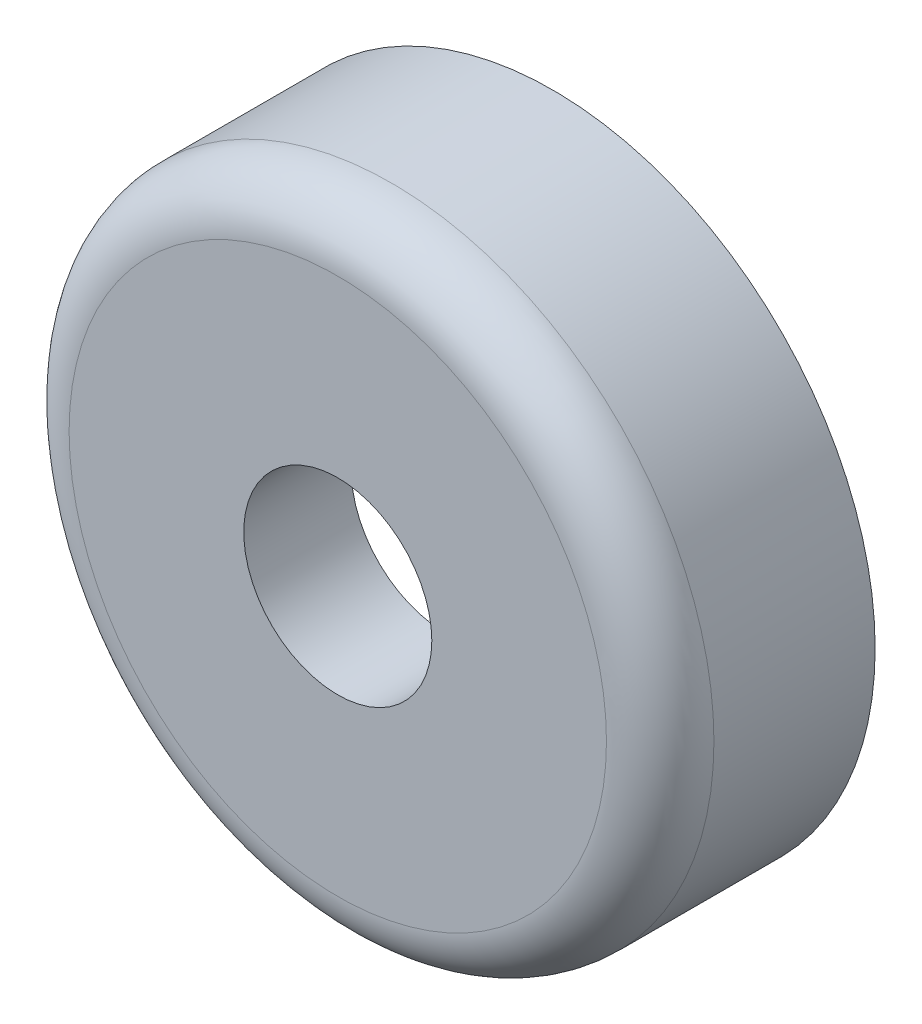
ISO-10303-21;
HEADER;
FILE_DESCRIPTION(('STEP AP214'),'2;1');
FILE_NAME('part.step','',(''),(''),'','','');
FILE_SCHEMA(('AUTOMOTIVE_DESIGN { 1 0 10303 214 1 1 1 1 }'));
ENDSEC;
DATA;
#1=APPLICATION_CONTEXT('core data for automotive mechanical design processes');
#2=APPLICATION_PROTOCOL_DEFINITION('international standard','automotive_design',2000,#1);
#3=PRODUCT_CONTEXT('',#1,'mechanical');
#4=PRODUCT('Part','Part','',(#3));
#5=PRODUCT_RELATED_PRODUCT_CATEGORY('part','',(#4));
#6=PRODUCT_DEFINITION_FORMATION('','',#4);
#7=PRODUCT_DEFINITION_CONTEXT('part definition',#1,'design');
#8=PRODUCT_DEFINITION('design','',#6,#7);
#9=PRODUCT_DEFINITION_SHAPE('','',#8);
#10=(LENGTH_UNIT() NAMED_UNIT(*) SI_UNIT(.MILLI.,.METRE.));
#11=(NAMED_UNIT(*) PLANE_ANGLE_UNIT() SI_UNIT($,.RADIAN.));
#12=(NAMED_UNIT(*) SI_UNIT($,.STERADIAN.) SOLID_ANGLE_UNIT());
#13=UNCERTAINTY_MEASURE_WITH_UNIT(LENGTH_MEASURE(1.E-05),#10,'distance_accuracy_value','');
#14=(GEOMETRIC_REPRESENTATION_CONTEXT(3) GLOBAL_UNCERTAINTY_ASSIGNED_CONTEXT((#13)) GLOBAL_UNIT_ASSIGNED_CONTEXT((#10,
#11,#12)) REPRESENTATION_CONTEXT('',''));
#15=CARTESIAN_POINT('',(0.,0.,0.));
#16=DIRECTION('',(0.,0.,1.));
#17=DIRECTION('',(1.,0.,0.));
#18=AXIS2_PLACEMENT_3D('',#15,#16,#17);
#19=CARTESIAN_POINT('',(0.,0.,0.));
#20=DIRECTION('',(0.,0.,1.));
#21=DIRECTION('',(1.,0.,0.));
#22=AXIS2_PLACEMENT_3D('',#19,#20,#21);
#23=PLANE('',#22);
#24=CARTESIAN_POINT('',(0.,0.,0.));
#25=DIRECTION('',(0.,0.,1.));
#26=DIRECTION('',(1.,0.,0.));
#27=AXIS2_PLACEMENT_3D('',#24,#25,#26);
#28=CIRCLE('',#27,5.1);
#29=CARTESIAN_POINT('',(5.1,0.,0.));
#30=VERTEX_POINT('',#29);
#31=EDGE_CURVE('E52',#30,#30,#28,.T.);
#32=ORIENTED_EDGE('',*,*,#31,.T.);
#33=EDGE_LOOP('',(#32));
#34=FACE_BOUND('',#33,.T.);
#35=CARTESIAN_POINT('',(0.,0.,0.));
#36=DIRECTION('',(0.,0.,1.));
#37=DIRECTION('',(1.,0.,0.));
#38=AXIS2_PLACEMENT_3D('',#35,#36,#37);
#39=CIRCLE('',#38,6.);
#40=CARTESIAN_POINT('',(6.,0.,0.));
#41=VERTEX_POINT('',#40);
#42=EDGE_CURVE('E57',#41,#41,#39,.T.);
#43=ORIENTED_EDGE('',*,*,#42,.F.);
#44=EDGE_LOOP('',(#43));
#45=FACE_BOUND('',#44,.T.);
#46=ADVANCED_FACE('F37',(#34,#45),#23,.F.);
#47=CARTESIAN_POINT('',(0.,0.,2.));
#48=DIRECTION('',(0.,0.,-1.));
#49=DIRECTION('',(-1.,0.,0.));
#50=AXIS2_PLACEMENT_3D('',#47,#48,#49);
#51=CYLINDRICAL_SURFACE('',#50,6.);
#52=CARTESIAN_POINT('',(0.,0.,3.));
#53=DIRECTION('',(0.,0.,1.));
#54=DIRECTION('',(1.,0.,0.));
#55=AXIS2_PLACEMENT_3D('',#52,#53,#54);
#56=CIRCLE('',#55,6.);
#57=CARTESIAN_POINT('',(6.,0.,3.));
#58=VERTEX_POINT('',#57);
#59=EDGE_CURVE('E10',#58,#58,#56,.F.);
#60=ORIENTED_EDGE('',*,*,#59,.T.);
#61=EDGE_LOOP('',(#60));
#62=FACE_BOUND('',#61,.T.);
#63=ORIENTED_EDGE('',*,*,#42,.T.);
#64=EDGE_LOOP('',(#63));
#65=FACE_BOUND('',#64,.T.);
#66=ADVANCED_FACE('F89',(#62,#65),#51,.T.);
#67=CARTESIAN_POINT('',(0.,0.,2.));
#68=DIRECTION('',(0.,0.,-1.));
#69=DIRECTION('',(-1.,0.,0.));
#70=AXIS2_PLACEMENT_3D('',#67,#68,#69);
#71=CYLINDRICAL_SURFACE('',#70,4.1);
#72=CARTESIAN_POINT('',(0.,0.,1.));
#73=DIRECTION('',(0.,0.,1.));
#74=DIRECTION('',(1.,0.,0.));
#75=AXIS2_PLACEMENT_3D('',#72,#73,#74);
#76=CIRCLE('',#75,4.1);
#77=CARTESIAN_POINT('',(4.1,0.,1.));
#78=VERTEX_POINT('',#77);
#79=EDGE_CURVE('E48',#78,#78,#76,.F.);
#80=ORIENTED_EDGE('',*,*,#79,.T.);
#81=EDGE_LOOP('',(#80));
#82=FACE_BOUND('',#81,.T.);
#83=CARTESIAN_POINT('',(0.,0.,2.));
#84=DIRECTION('',(0.,0.,1.));
#85=DIRECTION('',(1.,0.,0.));
#86=AXIS2_PLACEMENT_3D('',#83,#84,#85);
#87=CIRCLE('',#86,4.1);
#88=CARTESIAN_POINT('',(4.1,0.,2.));
#89=VERTEX_POINT('',#88);
#90=EDGE_CURVE('E60',#89,#89,#87,.T.);
#91=ORIENTED_EDGE('',*,*,#90,.T.);
#92=EDGE_LOOP('',(#91));
#93=FACE_BOUND('',#92,.T.);
#94=ADVANCED_FACE('F85',(#82,#93),#71,.F.);
#95=CARTESIAN_POINT('',(0.,0.,2.));
#96=DIRECTION('',(0.,0.,1.));
#97=DIRECTION('',(1.,0.,0.));
#98=AXIS2_PLACEMENT_3D('',#95,#96,#97);
#99=PLANE('',#98);
#100=CARTESIAN_POINT('',(0.,0.,2.));
#101=DIRECTION('',(0.,0.,1.));
#102=DIRECTION('',(1.,0.,0.));
#103=AXIS2_PLACEMENT_3D('',#100,#101,#102);
#104=CIRCLE('',#103,1.75);
#105=CARTESIAN_POINT('',(1.75,0.,2.));
#106=VERTEX_POINT('',#105);
#107=EDGE_CURVE('E64',#106,#106,#104,.T.);
#108=ORIENTED_EDGE('',*,*,#107,.T.);
#109=EDGE_LOOP('',(#108));
#110=FACE_BOUND('',#109,.T.);
#111=ORIENTED_EDGE('',*,*,#90,.F.);
#112=EDGE_LOOP('',(#111));
#113=FACE_BOUND('',#112,.T.);
#114=ADVANCED_FACE('F75',(#110,#113),#99,.F.);
#115=CARTESIAN_POINT('',(0.,0.,4.));
#116=DIRECTION('',(0.,0.,1.));
#117=DIRECTION('',(1.,0.,0.));
#118=AXIS2_PLACEMENT_3D('',#115,#116,#117);
#119=PLANE('',#118);
#120=CARTESIAN_POINT('',(0.,0.,4.));
#121=DIRECTION('',(0.,0.,1.));
#122=DIRECTION('',(1.,0.,0.));
#123=AXIS2_PLACEMENT_3D('',#120,#121,#122);
#124=CIRCLE('',#123,5.);
#125=CARTESIAN_POINT('',(5.,0.,4.));
#126=VERTEX_POINT('',#125);
#127=EDGE_CURVE('E44',#126,#126,#124,.T.);
#128=ORIENTED_EDGE('',*,*,#127,.T.);
#129=EDGE_LOOP('',(#128));
#130=FACE_BOUND('',#129,.T.);
#131=CARTESIAN_POINT('',(0.,0.,4.));
#132=DIRECTION('',(0.,0.,1.));
#133=DIRECTION('',(1.,0.,0.));
#134=AXIS2_PLACEMENT_3D('',#131,#132,#133);
#135=CIRCLE('',#134,1.75);
#136=CARTESIAN_POINT('',(1.75,0.,4.));
#137=VERTEX_POINT('',#136);
#138=EDGE_CURVE('E63',#137,#137,#135,.T.);
#139=ORIENTED_EDGE('',*,*,#138,.F.);
#140=EDGE_LOOP('',(#139));
#141=FACE_BOUND('',#140,.T.);
#142=ADVANCED_FACE('F73',(#130,#141),#119,.T.);
#143=CARTESIAN_POINT('',(0.,0.,4.));
#144=DIRECTION('',(0.,0.,-1.));
#145=DIRECTION('',(-1.,0.,0.));
#146=AXIS2_PLACEMENT_3D('',#143,#144,#145);
#147=CYLINDRICAL_SURFACE('',#146,1.75);
#148=ORIENTED_EDGE('',*,*,#138,.T.);
#149=EDGE_LOOP('',(#148));
#150=FACE_BOUND('',#149,.T.);
#151=ORIENTED_EDGE('',*,*,#107,.F.);
#152=EDGE_LOOP('',(#151));
#153=FACE_BOUND('',#152,.T.);
#154=ADVANCED_FACE('F70',(#150,#153),#147,.F.);
#155=CARTESIAN_POINT('',(0.,0.,1.));
#156=DIRECTION('',(0.,0.,1.));
#157=DIRECTION('',(1.,0.,0.));
#158=AXIS2_PLACEMENT_3D('',#155,#156,#157);
#159=TOROIDAL_SURFACE('',#158,5.1,1.);
#160=ORIENTED_EDGE('',*,*,#79,.F.);
#161=EDGE_LOOP('',(#160));
#162=FACE_BOUND('',#161,.T.);
#163=ORIENTED_EDGE('',*,*,#31,.F.);
#164=EDGE_LOOP('',(#163));
#165=FACE_BOUND('',#164,.T.);
#166=ADVANCED_FACE('F82',(#162,#165),#159,.T.);
#167=CARTESIAN_POINT('',(0.,0.,3.));
#168=DIRECTION('',(0.,0.,1.));
#169=DIRECTION('',(1.,0.,0.));
#170=AXIS2_PLACEMENT_3D('',#167,#168,#169);
#171=TOROIDAL_SURFACE('',#170,5.,1.);
#172=ORIENTED_EDGE('',*,*,#59,.F.);
#173=EDGE_LOOP('',(#172));
#174=FACE_BOUND('',#173,.T.);
#175=ORIENTED_EDGE('',*,*,#127,.F.);
#176=EDGE_LOOP('',(#175));
#177=FACE_BOUND('',#176,.T.);
#178=ADVANCED_FACE('F39',(#174,#177),#171,.T.);
#179=CLOSED_SHELL('',(#46,#66,#94,#114,#142,#154,#166,#178));
#180=MANIFOLD_SOLID_BREP('B2',#179);
#181=ADVANCED_BREP_SHAPE_REPRESENTATION('',(#18,#180),#14);
#182=SHAPE_DEFINITION_REPRESENTATION(#9,#181);
ENDSEC;
END-ISO-10303-21;
